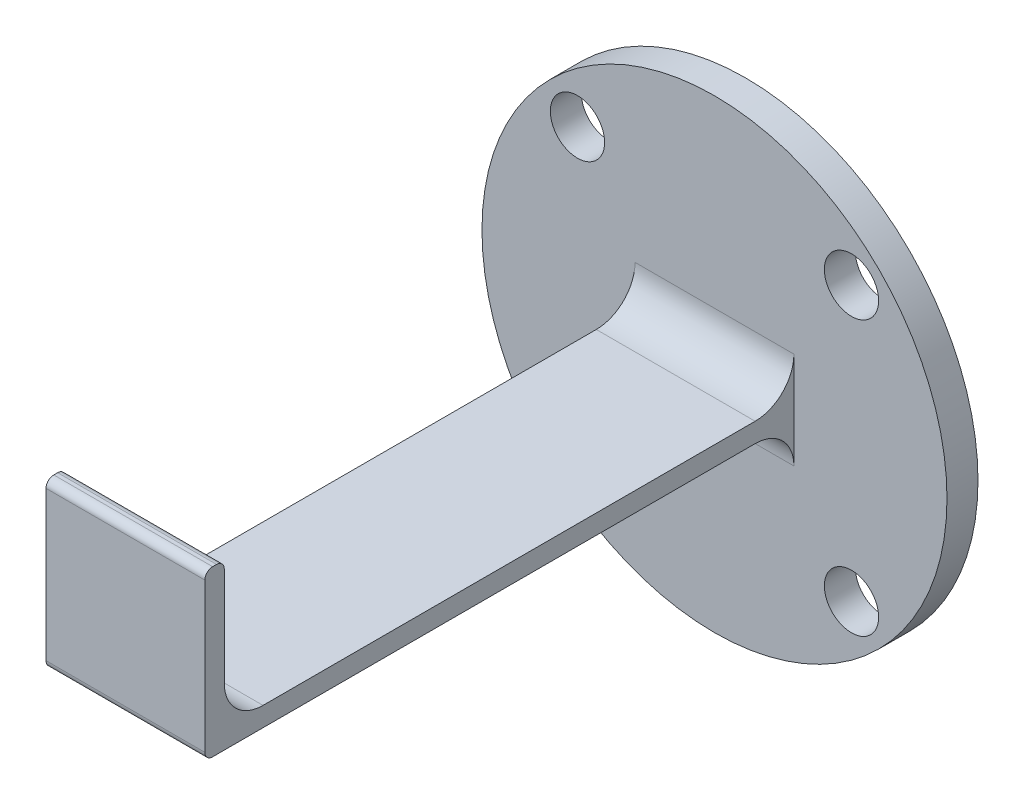
ISO-10303-21;
HEADER;
FILE_DESCRIPTION(('STEP AP214'),'2;1');
FILE_NAME('part.step','',(''),(''),'','','');
FILE_SCHEMA(('AUTOMOTIVE_DESIGN { 1 0 10303 214 1 1 1 1 }'));
ENDSEC;
DATA;
#1=APPLICATION_CONTEXT('core data for automotive mechanical design processes');
#2=APPLICATION_PROTOCOL_DEFINITION('international standard','automotive_design',2000,#1);
#3=PRODUCT_CONTEXT('',#1,'mechanical');
#4=PRODUCT('Part','Part','',(#3));
#5=PRODUCT_RELATED_PRODUCT_CATEGORY('part','',(#4));
#6=PRODUCT_DEFINITION_FORMATION('','',#4);
#7=PRODUCT_DEFINITION_CONTEXT('part definition',#1,'design');
#8=PRODUCT_DEFINITION('design','',#6,#7);
#9=PRODUCT_DEFINITION_SHAPE('','',#8);
#10=(LENGTH_UNIT() NAMED_UNIT(*) SI_UNIT(.MILLI.,.METRE.));
#11=(NAMED_UNIT(*) PLANE_ANGLE_UNIT() SI_UNIT($,.RADIAN.));
#12=(NAMED_UNIT(*) SI_UNIT($,.STERADIAN.) SOLID_ANGLE_UNIT());
#13=UNCERTAINTY_MEASURE_WITH_UNIT(LENGTH_MEASURE(1.E-05),#10,'distance_accuracy_value','');
#14=(GEOMETRIC_REPRESENTATION_CONTEXT(3) GLOBAL_UNCERTAINTY_ASSIGNED_CONTEXT((#13)) GLOBAL_UNIT_ASSIGNED_CONTEXT((#10,
#11,#12)) REPRESENTATION_CONTEXT('',''));
#15=CARTESIAN_POINT('',(0.,0.,0.));
#16=DIRECTION('',(0.,0.,1.));
#17=DIRECTION('',(1.,0.,0.));
#18=AXIS2_PLACEMENT_3D('',#15,#16,#17);
#19=CARTESIAN_POINT('',(-10.25,1.25,80.));
#20=DIRECTION('',(0.,-1.,0.));
#21=DIRECTION('',(0.,0.,-1.));
#22=AXIS2_PLACEMENT_3D('',#19,#20,#21);
#23=PLANE('',#22);
#24=DIRECTION('',(0.,0.,-1.));
#25=VECTOR('',#24,1.);
#26=CARTESIAN_POINT('',(-10.25,1.25,80.));
#27=LINE('',#26,#25);
#28=CARTESIAN_POINT('',(-10.25,1.25,72.5));
#29=VERTEX_POINT('',#28);
#30=CARTESIAN_POINT('',(-10.25,1.25,8.99999999999999));
#31=VERTEX_POINT('',#30);
#32=EDGE_CURVE('E259',#29,#31,#27,.T.);
#33=ORIENTED_EDGE('',*,*,#32,.F.);
#34=DIRECTION('',(-1.,0.,0.));
#35=VECTOR('',#34,1.);
#36=CARTESIAN_POINT('',(10.25,1.25,72.5));
#37=LINE('',#36,#35);
#38=CARTESIAN_POINT('',(10.25,1.25,72.5));
#39=VERTEX_POINT('',#38);
#40=EDGE_CURVE('E160',#29,#39,#37,.F.);
#41=ORIENTED_EDGE('',*,*,#40,.T.);
#42=DIRECTION('',(0.,0.,-1.));
#43=VECTOR('',#42,1.);
#44=CARTESIAN_POINT('',(10.25,1.25,80.));
#45=LINE('',#44,#43);
#46=CARTESIAN_POINT('',(10.25,1.25,8.99999999999999));
#47=VERTEX_POINT('',#46);
#48=EDGE_CURVE('E145',#39,#47,#45,.T.);
#49=ORIENTED_EDGE('',*,*,#48,.T.);
#50=DIRECTION('',(1.,0.,0.));
#51=VECTOR('',#50,1.);
#52=CARTESIAN_POINT('',(-10.25,1.25,8.99999999999999));
#53=LINE('',#52,#51);
#54=EDGE_CURVE('E155',#47,#31,#53,.F.);
#55=ORIENTED_EDGE('',*,*,#54,.T.);
#56=EDGE_LOOP('',(#33,#41,#49,#55));
#57=FACE_BOUND('',#56,.T.);
#58=ADVANCED_FACE('F38',(#57),#23,.F.);
#59=CARTESIAN_POINT('',(0.,0.,4.));
#60=DIRECTION('',(0.,0.,1.));
#61=DIRECTION('',(1.,0.,0.));
#62=AXIS2_PLACEMENT_3D('',#59,#60,#61);
#63=PLANE('',#62);
#64=CARTESIAN_POINT('',(-17.6776695296637,-17.6776695296637,4.));
#65=DIRECTION('',(0.,0.,1.));
#66=DIRECTION('',(-1.,0.,0.));
#67=AXIS2_PLACEMENT_3D('',#64,#65,#66);
#68=CIRCLE('',#67,3.5);
#69=CARTESIAN_POINT('',(-21.1776695296637,-17.6776695296637,4.));
#70=VERTEX_POINT('',#69);
#71=EDGE_CURVE('E271',#70,#70,#68,.T.);
#72=ORIENTED_EDGE('',*,*,#71,.F.);
#73=EDGE_LOOP('',(#72));
#74=FACE_BOUND('',#73,.T.);
#75=CARTESIAN_POINT('',(17.6776695296637,-17.6776695296637,4.));
#76=DIRECTION('',(0.,0.,1.));
#77=DIRECTION('',(1.,0.,0.));
#78=AXIS2_PLACEMENT_3D('',#75,#76,#77);
#79=CIRCLE('',#78,3.5);
#80=CARTESIAN_POINT('',(21.1776695296637,-17.6776695296637,4.));
#81=VERTEX_POINT('',#80);
#82=EDGE_CURVE('E285',#81,#81,#79,.T.);
#83=ORIENTED_EDGE('',*,*,#82,.F.);
#84=EDGE_LOOP('',(#83));
#85=FACE_BOUND('',#84,.T.);
#86=CARTESIAN_POINT('',(17.6776695296637,17.6776695296637,4.));
#87=DIRECTION('',(0.,0.,1.));
#88=DIRECTION('',(-1.,0.,0.));
#89=AXIS2_PLACEMENT_3D('',#86,#87,#88);
#90=CIRCLE('',#89,3.5);
#91=CARTESIAN_POINT('',(14.1776695296637,17.6776695296637,4.));
#92=VERTEX_POINT('',#91);
#93=EDGE_CURVE('E277',#92,#92,#90,.T.);
#94=ORIENTED_EDGE('',*,*,#93,.F.);
#95=EDGE_LOOP('',(#94));
#96=FACE_BOUND('',#95,.T.);
#97=CARTESIAN_POINT('',(-17.6776695296637,17.6776695296637,4.));
#98=DIRECTION('',(0.,0.,1.));
#99=DIRECTION('',(1.,0.,0.));
#100=AXIS2_PLACEMENT_3D('',#97,#98,#99);
#101=CIRCLE('',#100,3.5);
#102=CARTESIAN_POINT('',(-14.1776695296637,17.6776695296637,4.));
#103=VERTEX_POINT('',#102);
#104=EDGE_CURVE('E276',#103,#103,#101,.T.);
#105=ORIENTED_EDGE('',*,*,#104,.F.);
#106=EDGE_LOOP('',(#105));
#107=FACE_BOUND('',#106,.T.);
#108=CARTESIAN_POINT('',(0.,0.,4.));
#109=DIRECTION('',(0.,0.,1.));
#110=DIRECTION('',(1.,0.,0.));
#111=AXIS2_PLACEMENT_3D('',#108,#109,#110);
#112=CIRCLE('',#111,30.);
#113=CARTESIAN_POINT('',(30.,0.,4.));
#114=VERTEX_POINT('',#113);
#115=EDGE_CURVE('E156',#114,#114,#112,.T.);
#116=ORIENTED_EDGE('',*,*,#115,.T.);
#117=EDGE_LOOP('',(#116));
#118=FACE_BOUND('',#117,.T.);
#119=DIRECTION('',(-1.,0.,0.));
#120=VECTOR('',#119,1.);
#121=CARTESIAN_POINT('',(0.,-6.25,4.));
#122=LINE('',#121,#120);
#123=CARTESIAN_POINT('',(10.25,-6.25,4.));
#124=VERTEX_POINT('',#123);
#125=CARTESIAN_POINT('',(-10.25,-6.25,4.));
#126=VERTEX_POINT('',#125);
#127=EDGE_CURVE('E173',#124,#126,#122,.T.);
#128=ORIENTED_EDGE('',*,*,#127,.T.);
#129=DIRECTION('',(0.,1.,0.));
#130=VECTOR('',#129,1.);
#131=CARTESIAN_POINT('',(-10.25,0.,4.));
#132=LINE('',#131,#130);
#133=CARTESIAN_POINT('',(-10.25,6.25,4.));
#134=VERTEX_POINT('',#133);
#135=EDGE_CURVE('E265',#126,#134,#132,.T.);
#136=ORIENTED_EDGE('',*,*,#135,.T.);
#137=DIRECTION('',(1.,0.,0.));
#138=VECTOR('',#137,1.);
#139=CARTESIAN_POINT('',(0.,6.25,4.));
#140=LINE('',#139,#138);
#141=CARTESIAN_POINT('',(10.25,6.25,4.));
#142=VERTEX_POINT('',#141);
#143=EDGE_CURVE('E169',#134,#142,#140,.T.);
#144=ORIENTED_EDGE('',*,*,#143,.T.);
#145=DIRECTION('',(0.,-1.,0.));
#146=VECTOR('',#145,1.);
#147=CARTESIAN_POINT('',(10.25,0.,4.));
#148=LINE('',#147,#146);
#149=EDGE_CURVE('E268',#142,#124,#148,.T.);
#150=ORIENTED_EDGE('',*,*,#149,.T.);
#151=EDGE_LOOP('',(#128,#136,#144,#150));
#152=FACE_BOUND('',#151,.T.);
#153=ADVANCED_FACE('F306',(#74,#85,#96,#107,#118,#152),#63,.T.);
#154=CARTESIAN_POINT('',(0.,0.,4.));
#155=DIRECTION('',(0.,0.,-1.));
#156=DIRECTION('',(-1.,0.,0.));
#157=AXIS2_PLACEMENT_3D('',#154,#155,#156);
#158=CYLINDRICAL_SURFACE('',#157,30.);
#159=ORIENTED_EDGE('',*,*,#115,.F.);
#160=EDGE_LOOP('',(#159));
#161=FACE_BOUND('',#160,.T.);
#162=CARTESIAN_POINT('',(0.,0.,0.));
#163=DIRECTION('',(0.,0.,1.));
#164=DIRECTION('',(1.,0.,0.));
#165=AXIS2_PLACEMENT_3D('',#162,#163,#164);
#166=CIRCLE('',#165,30.);
#167=CARTESIAN_POINT('',(30.,0.,0.));
#168=VERTEX_POINT('',#167);
#169=EDGE_CURVE('E163',#168,#168,#166,.T.);
#170=ORIENTED_EDGE('',*,*,#169,.T.);
#171=EDGE_LOOP('',(#170));
#172=FACE_BOUND('',#171,.T.);
#173=ADVANCED_FACE('F309',(#161,#172),#158,.T.);
#174=CARTESIAN_POINT('',(0.,0.,0.));
#175=DIRECTION('',(0.,0.,1.));
#176=DIRECTION('',(1.,0.,0.));
#177=AXIS2_PLACEMENT_3D('',#174,#175,#176);
#178=PLANE('',#177);
#179=ORIENTED_EDGE('',*,*,#169,.F.);
#180=EDGE_LOOP('',(#179));
#181=FACE_BOUND('',#180,.T.);
#182=CARTESIAN_POINT('',(-17.6776695296637,17.6776695296637,0.));
#183=DIRECTION('',(0.,0.,1.));
#184=DIRECTION('',(1.,0.,0.));
#185=AXIS2_PLACEMENT_3D('',#182,#183,#184);
#186=CIRCLE('',#185,3.5);
#187=CARTESIAN_POINT('',(-14.1776695296637,17.6776695296637,0.));
#188=VERTEX_POINT('',#187);
#189=EDGE_CURVE('E296',#188,#188,#186,.T.);
#190=ORIENTED_EDGE('',*,*,#189,.T.);
#191=EDGE_LOOP('',(#190));
#192=FACE_BOUND('',#191,.T.);
#193=CARTESIAN_POINT('',(17.6776695296637,17.6776695296637,0.));
#194=DIRECTION('',(0.,0.,1.));
#195=DIRECTION('',(-1.,0.,0.));
#196=AXIS2_PLACEMENT_3D('',#193,#194,#195);
#197=CIRCLE('',#196,3.5);
#198=CARTESIAN_POINT('',(14.1776695296637,17.6776695296637,0.));
#199=VERTEX_POINT('',#198);
#200=EDGE_CURVE('E272',#199,#199,#197,.T.);
#201=ORIENTED_EDGE('',*,*,#200,.T.);
#202=EDGE_LOOP('',(#201));
#203=FACE_BOUND('',#202,.T.);
#204=CARTESIAN_POINT('',(17.6776695296637,-17.6776695296637,0.));
#205=DIRECTION('',(0.,0.,1.));
#206=DIRECTION('',(1.,0.,0.));
#207=AXIS2_PLACEMENT_3D('',#204,#205,#206);
#208=CIRCLE('',#207,3.5);
#209=CARTESIAN_POINT('',(21.1776695296637,-17.6776695296637,0.));
#210=VERTEX_POINT('',#209);
#211=EDGE_CURVE('E281',#210,#210,#208,.T.);
#212=ORIENTED_EDGE('',*,*,#211,.T.);
#213=EDGE_LOOP('',(#212));
#214=FACE_BOUND('',#213,.T.);
#215=CARTESIAN_POINT('',(-17.6776695296637,-17.6776695296637,0.));
#216=DIRECTION('',(0.,0.,1.));
#217=DIRECTION('',(-1.,0.,0.));
#218=AXIS2_PLACEMENT_3D('',#215,#216,#217);
#219=CIRCLE('',#218,3.5);
#220=CARTESIAN_POINT('',(-21.1776695296637,-17.6776695296637,0.));
#221=VERTEX_POINT('',#220);
#222=EDGE_CURVE('E289',#221,#221,#219,.T.);
#223=ORIENTED_EDGE('',*,*,#222,.T.);
#224=EDGE_LOOP('',(#223));
#225=FACE_BOUND('',#224,.T.);
#226=ADVANCED_FACE('F352',(#181,#192,#203,#214,#225),#178,.F.);
#227=CARTESIAN_POINT('',(-17.6776695296637,17.6776695296637,0.));
#228=DIRECTION('',(0.,0.,1.));
#229=DIRECTION('',(1.,0.,0.));
#230=AXIS2_PLACEMENT_3D('',#227,#228,#229);
#231=CYLINDRICAL_SURFACE('',#230,3.5);
#232=ORIENTED_EDGE('',*,*,#189,.F.);
#233=EDGE_LOOP('',(#232));
#234=FACE_BOUND('',#233,.T.);
#235=ORIENTED_EDGE('',*,*,#104,.T.);
#236=EDGE_LOOP('',(#235));
#237=FACE_BOUND('',#236,.T.);
#238=ADVANCED_FACE('F304',(#234,#237),#231,.F.);
#239=CARTESIAN_POINT('',(17.6776695296637,17.6776695296637,0.));
#240=DIRECTION('',(0.,0.,1.));
#241=DIRECTION('',(1.,0.,0.));
#242=AXIS2_PLACEMENT_3D('',#239,#240,#241);
#243=CYLINDRICAL_SURFACE('',#242,3.5);
#244=ORIENTED_EDGE('',*,*,#200,.F.);
#245=EDGE_LOOP('',(#244));
#246=FACE_BOUND('',#245,.T.);
#247=ORIENTED_EDGE('',*,*,#93,.T.);
#248=EDGE_LOOP('',(#247));
#249=FACE_BOUND('',#248,.T.);
#250=ADVANCED_FACE('F340',(#246,#249),#243,.F.);
#251=CARTESIAN_POINT('',(17.6776695296637,-17.6776695296637,0.));
#252=DIRECTION('',(0.,0.,1.));
#253=DIRECTION('',(1.,0.,0.));
#254=AXIS2_PLACEMENT_3D('',#251,#252,#253);
#255=CYLINDRICAL_SURFACE('',#254,3.5);
#256=ORIENTED_EDGE('',*,*,#211,.F.);
#257=EDGE_LOOP('',(#256));
#258=FACE_BOUND('',#257,.T.);
#259=ORIENTED_EDGE('',*,*,#82,.T.);
#260=EDGE_LOOP('',(#259));
#261=FACE_BOUND('',#260,.T.);
#262=ADVANCED_FACE('F343',(#258,#261),#255,.F.);
#263=CARTESIAN_POINT('',(-17.6776695296637,-17.6776695296637,0.));
#264=DIRECTION('',(0.,0.,1.));
#265=DIRECTION('',(1.,0.,0.));
#266=AXIS2_PLACEMENT_3D('',#263,#264,#265);
#267=CYLINDRICAL_SURFACE('',#266,3.5);
#268=ORIENTED_EDGE('',*,*,#222,.F.);
#269=EDGE_LOOP('',(#268));
#270=FACE_BOUND('',#269,.T.);
#271=ORIENTED_EDGE('',*,*,#71,.T.);
#272=EDGE_LOOP('',(#271));
#273=FACE_BOUND('',#272,.T.);
#274=ADVANCED_FACE('F339',(#270,#273),#267,.F.);
#275=CARTESIAN_POINT('',(10.25,-1.25,80.));
#276=DIRECTION('',(-1.,0.,0.));
#277=DIRECTION('',(0.,0.,1.));
#278=AXIS2_PLACEMENT_3D('',#275,#276,#277);
#279=PLANE('',#278);
#280=DIRECTION('',(0.,1.,0.));
#281=VECTOR('',#280,1.);
#282=CARTESIAN_POINT('',(10.25,-1.25,80.));
#283=LINE('',#282,#281);
#284=CARTESIAN_POINT('',(10.25,-0.25,80.));
#285=VERTEX_POINT('',#284);
#286=CARTESIAN_POINT('',(10.25,19.,80.));
#287=VERTEX_POINT('',#286);
#288=EDGE_CURVE('E136',#285,#287,#283,.T.);
#289=ORIENTED_EDGE('',*,*,#288,.F.);
#290=CARTESIAN_POINT('',(10.25,-0.25,79.));
#291=DIRECTION('',(-1.,0.,0.));
#292=DIRECTION('',(0.,0.,1.));
#293=AXIS2_PLACEMENT_3D('',#290,#291,#292);
#294=CIRCLE('',#293,1.);
#295=CARTESIAN_POINT('',(10.25,-1.25,79.));
#296=VERTEX_POINT('',#295);
#297=EDGE_CURVE('E210',#285,#296,#294,.F.);
#298=ORIENTED_EDGE('',*,*,#297,.T.);
#299=DIRECTION('',(0.,0.,-1.));
#300=VECTOR('',#299,1.);
#301=CARTESIAN_POINT('',(10.25,-1.25,80.));
#302=LINE('',#301,#300);
#303=CARTESIAN_POINT('',(10.25,-1.25,8.99999999999999));
#304=VERTEX_POINT('',#303);
#305=EDGE_CURVE('E253',#296,#304,#302,.T.);
#306=ORIENTED_EDGE('',*,*,#305,.T.);
#307=CARTESIAN_POINT('',(10.25,-6.25,9.));
#308=DIRECTION('',(-1.,0.,0.));
#309=DIRECTION('',(0.,0.,1.));
#310=AXIS2_PLACEMENT_3D('',#307,#308,#309);
#311=CIRCLE('',#310,5.);
#312=EDGE_CURVE('E186',#304,#124,#311,.T.);
#313=ORIENTED_EDGE('',*,*,#312,.T.);
#314=ORIENTED_EDGE('',*,*,#149,.F.);
#315=CARTESIAN_POINT('',(10.25,6.25,9.));
#316=DIRECTION('',(-1.,0.,0.));
#317=DIRECTION('',(0.,0.,1.));
#318=AXIS2_PLACEMENT_3D('',#315,#316,#317);
#319=CIRCLE('',#318,5.);
#320=EDGE_CURVE('E190',#142,#47,#319,.T.);
#321=ORIENTED_EDGE('',*,*,#320,.T.);
#322=ORIENTED_EDGE('',*,*,#48,.F.);
#323=CARTESIAN_POINT('',(10.25,6.25,72.5));
#324=DIRECTION('',(-1.,0.,0.));
#325=DIRECTION('',(0.,0.,1.));
#326=AXIS2_PLACEMENT_3D('',#323,#324,#325);
#327=CIRCLE('',#326,5.);
#328=CARTESIAN_POINT('',(10.25,6.25,77.5));
#329=VERTEX_POINT('',#328);
#330=EDGE_CURVE('E141',#39,#329,#327,.T.);
#331=ORIENTED_EDGE('',*,*,#330,.T.);
#332=DIRECTION('',(0.,-1.,0.));
#333=VECTOR('',#332,1.);
#334=CARTESIAN_POINT('',(10.25,20.,77.5));
#335=LINE('',#334,#333);
#336=CARTESIAN_POINT('',(10.25,19.,77.5));
#337=VERTEX_POINT('',#336);
#338=EDGE_CURVE('E127',#337,#329,#335,.T.);
#339=ORIENTED_EDGE('',*,*,#338,.F.);
#340=CARTESIAN_POINT('',(10.25,19.,78.5));
#341=DIRECTION('',(-1.,0.,0.));
#342=DIRECTION('',(0.,0.,1.));
#343=AXIS2_PLACEMENT_3D('',#340,#341,#342);
#344=CIRCLE('',#343,1.);
#345=CARTESIAN_POINT('',(10.25,20.,78.5));
#346=VERTEX_POINT('',#345);
#347=EDGE_CURVE('E207',#337,#346,#344,.F.);
#348=ORIENTED_EDGE('',*,*,#347,.T.);
#349=DIRECTION('',(0.,0.,-1.));
#350=VECTOR('',#349,1.);
#351=CARTESIAN_POINT('',(10.25,20.,80.));
#352=LINE('',#351,#350);
#353=CARTESIAN_POINT('',(10.25,20.,79.));
#354=VERTEX_POINT('',#353);
#355=EDGE_CURVE('E235',#354,#346,#352,.T.);
#356=ORIENTED_EDGE('',*,*,#355,.F.);
#357=CARTESIAN_POINT('',(10.25,19.,79.));
#358=DIRECTION('',(-1.,0.,0.));
#359=DIRECTION('',(0.,0.,1.));
#360=AXIS2_PLACEMENT_3D('',#357,#358,#359);
#361=CIRCLE('',#360,1.);
#362=EDGE_CURVE('E204',#354,#287,#361,.F.);
#363=ORIENTED_EDGE('',*,*,#362,.T.);
#364=EDGE_LOOP('',(#289,#298,#306,#313,#314,#321,#322,#331,#339,#348,#356,#363));
#365=FACE_BOUND('',#364,.T.);
#366=ADVANCED_FACE('F143',(#365),#279,.F.);
#367=CARTESIAN_POINT('',(-10.25,-1.25,80.));
#368=DIRECTION('',(1.,0.,0.));
#369=DIRECTION('',(0.,0.,-1.));
#370=AXIS2_PLACEMENT_3D('',#367,#368,#369);
#371=PLANE('',#370);
#372=DIRECTION('',(0.,0.,-1.));
#373=VECTOR('',#372,1.);
#374=CARTESIAN_POINT('',(-10.25,-1.25,80.));
#375=LINE('',#374,#373);
#376=CARTESIAN_POINT('',(-10.25,-1.25,79.));
#377=VERTEX_POINT('',#376);
#378=CARTESIAN_POINT('',(-10.25,-1.25,8.99999999999999));
#379=VERTEX_POINT('',#378);
#380=EDGE_CURVE('E256',#377,#379,#375,.T.);
#381=ORIENTED_EDGE('',*,*,#380,.F.);
#382=CARTESIAN_POINT('',(-10.25,-0.25,79.));
#383=DIRECTION('',(1.,0.,0.));
#384=DIRECTION('',(0.,0.,-1.));
#385=AXIS2_PLACEMENT_3D('',#382,#383,#384);
#386=CIRCLE('',#385,1.);
#387=CARTESIAN_POINT('',(-10.25,-0.25,80.));
#388=VERTEX_POINT('',#387);
#389=EDGE_CURVE('E220',#377,#388,#386,.F.);
#390=ORIENTED_EDGE('',*,*,#389,.T.);
#391=DIRECTION('',(0.,-1.,0.));
#392=VECTOR('',#391,1.);
#393=CARTESIAN_POINT('',(-10.25,-1.25,80.));
#394=LINE('',#393,#392);
#395=CARTESIAN_POINT('',(-10.25,19.,80.));
#396=VERTEX_POINT('',#395);
#397=EDGE_CURVE('E249',#396,#388,#394,.T.);
#398=ORIENTED_EDGE('',*,*,#397,.F.);
#399=CARTESIAN_POINT('',(-10.25,19.,79.));
#400=DIRECTION('',(1.,0.,0.));
#401=DIRECTION('',(0.,0.,-1.));
#402=AXIS2_PLACEMENT_3D('',#399,#400,#401);
#403=CIRCLE('',#402,1.);
#404=CARTESIAN_POINT('',(-10.25,20.,79.));
#405=VERTEX_POINT('',#404);
#406=EDGE_CURVE('E60',#396,#405,#403,.F.);
#407=ORIENTED_EDGE('',*,*,#406,.T.);
#408=DIRECTION('',(0.,0.,1.));
#409=VECTOR('',#408,1.);
#410=CARTESIAN_POINT('',(-10.25,20.,80.));
#411=LINE('',#410,#409);
#412=CARTESIAN_POINT('',(-10.25,20.,78.5));
#413=VERTEX_POINT('',#412);
#414=EDGE_CURVE('E232',#413,#405,#411,.T.);
#415=ORIENTED_EDGE('',*,*,#414,.F.);
#416=CARTESIAN_POINT('',(-10.25,19.,78.5));
#417=DIRECTION('',(1.,0.,0.));
#418=DIRECTION('',(0.,0.,-1.));
#419=AXIS2_PLACEMENT_3D('',#416,#417,#418);
#420=CIRCLE('',#419,1.);
#421=CARTESIAN_POINT('',(-10.25,19.,77.5));
#422=VERTEX_POINT('',#421);
#423=EDGE_CURVE('E54',#413,#422,#420,.F.);
#424=ORIENTED_EDGE('',*,*,#423,.T.);
#425=DIRECTION('',(0.,-1.,0.));
#426=VECTOR('',#425,1.);
#427=CARTESIAN_POINT('',(-10.25,20.,77.5));
#428=LINE('',#427,#426);
#429=CARTESIAN_POINT('',(-10.25,6.25,77.5));
#430=VERTEX_POINT('',#429);
#431=EDGE_CURVE('E137',#422,#430,#428,.T.);
#432=ORIENTED_EDGE('',*,*,#431,.T.);
#433=CARTESIAN_POINT('',(-10.25,6.25,72.5));
#434=DIRECTION('',(1.,0.,0.));
#435=DIRECTION('',(0.,0.,-1.));
#436=AXIS2_PLACEMENT_3D('',#433,#434,#435);
#437=CIRCLE('',#436,5.);
#438=EDGE_CURVE('E150',#430,#29,#437,.T.);
#439=ORIENTED_EDGE('',*,*,#438,.T.);
#440=ORIENTED_EDGE('',*,*,#32,.T.);
#441=CARTESIAN_POINT('',(-10.25,6.25,9.));
#442=DIRECTION('',(1.,0.,0.));
#443=DIRECTION('',(0.,0.,-1.));
#444=AXIS2_PLACEMENT_3D('',#441,#442,#443);
#445=CIRCLE('',#444,5.);
#446=EDGE_CURVE('E193',#31,#134,#445,.T.);
#447=ORIENTED_EDGE('',*,*,#446,.T.);
#448=ORIENTED_EDGE('',*,*,#135,.F.);
#449=CARTESIAN_POINT('',(-10.25,-6.25,9.));
#450=DIRECTION('',(1.,0.,0.));
#451=DIRECTION('',(0.,0.,-1.));
#452=AXIS2_PLACEMENT_3D('',#449,#450,#451);
#453=CIRCLE('',#452,5.);
#454=EDGE_CURVE('E149',#126,#379,#453,.T.);
#455=ORIENTED_EDGE('',*,*,#454,.T.);
#456=EDGE_LOOP('',(#381,#390,#398,#407,#415,#424,#432,#439,#440,#447,#448,#455));
#457=FACE_BOUND('',#456,.T.);
#458=ADVANCED_FACE('F238',(#457),#371,.F.);
#459=CARTESIAN_POINT('',(-10.25,-1.25,80.));
#460=DIRECTION('',(0.,1.,0.));
#461=DIRECTION('',(0.,0.,1.));
#462=AXIS2_PLACEMENT_3D('',#459,#460,#461);
#463=PLANE('',#462);
#464=ORIENTED_EDGE('',*,*,#305,.F.);
#465=DIRECTION('',(1.,0.,0.));
#466=VECTOR('',#465,1.);
#467=CARTESIAN_POINT('',(-10.25,-1.25,79.));
#468=LINE('',#467,#466);
#469=EDGE_CURVE('E213',#296,#377,#468,.F.);
#470=ORIENTED_EDGE('',*,*,#469,.T.);
#471=ORIENTED_EDGE('',*,*,#380,.T.);
#472=DIRECTION('',(-1.,0.,0.));
#473=VECTOR('',#472,1.);
#474=CARTESIAN_POINT('',(-10.25,-1.25,8.99999999999999));
#475=LINE('',#474,#473);
#476=EDGE_CURVE('E177',#379,#304,#475,.F.);
#477=ORIENTED_EDGE('',*,*,#476,.T.);
#478=EDGE_LOOP('',(#464,#470,#471,#477));
#479=FACE_BOUND('',#478,.T.);
#480=ADVANCED_FACE('F383',(#479),#463,.F.);
#481=CARTESIAN_POINT('',(0.,0.,80.));
#482=DIRECTION('',(0.,0.,-1.));
#483=DIRECTION('',(-1.,0.,0.));
#484=AXIS2_PLACEMENT_3D('',#481,#482,#483);
#485=PLANE('',#484);
#486=ORIENTED_EDGE('',*,*,#397,.T.);
#487=DIRECTION('',(1.,0.,0.));
#488=VECTOR('',#487,1.);
#489=CARTESIAN_POINT('',(0.,-0.25,80.));
#490=LINE('',#489,#488);
#491=EDGE_CURVE('E200',#388,#285,#490,.T.);
#492=ORIENTED_EDGE('',*,*,#491,.T.);
#493=ORIENTED_EDGE('',*,*,#288,.T.);
#494=DIRECTION('',(1.,0.,0.));
#495=VECTOR('',#494,1.);
#496=CARTESIAN_POINT('',(0.,19.,80.));
#497=LINE('',#496,#495);
#498=EDGE_CURVE('E197',#287,#396,#497,.F.);
#499=ORIENTED_EDGE('',*,*,#498,.T.);
#500=EDGE_LOOP('',(#486,#492,#493,#499));
#501=FACE_BOUND('',#500,.T.);
#502=ADVANCED_FACE('F378',(#501),#485,.F.);
#503=CARTESIAN_POINT('',(-10.25,20.,77.5));
#504=DIRECTION('',(0.,0.,1.));
#505=DIRECTION('',(1.,0.,0.));
#506=AXIS2_PLACEMENT_3D('',#503,#504,#505);
#507=PLANE('',#506);
#508=ORIENTED_EDGE('',*,*,#431,.F.);
#509=DIRECTION('',(-1.,0.,0.));
#510=VECTOR('',#509,1.);
#511=CARTESIAN_POINT('',(-10.25,19.,77.5));
#512=LINE('',#511,#510);
#513=EDGE_CURVE('E11',#422,#337,#512,.F.);
#514=ORIENTED_EDGE('',*,*,#513,.T.);
#515=ORIENTED_EDGE('',*,*,#338,.T.);
#516=DIRECTION('',(-1.,0.,0.));
#517=VECTOR('',#516,1.);
#518=CARTESIAN_POINT('',(-10.25,6.25,77.5));
#519=LINE('',#518,#517);
#520=EDGE_CURVE('E131',#329,#430,#519,.T.);
#521=ORIENTED_EDGE('',*,*,#520,.T.);
#522=EDGE_LOOP('',(#508,#514,#515,#521));
#523=FACE_BOUND('',#522,.T.);
#524=ADVANCED_FACE('F129',(#523),#507,.F.);
#525=CARTESIAN_POINT('',(0.,20.,0.));
#526=DIRECTION('',(0.,-1.,0.));
#527=DIRECTION('',(0.,0.,-1.));
#528=AXIS2_PLACEMENT_3D('',#525,#526,#527);
#529=PLANE('',#528);
#530=ORIENTED_EDGE('',*,*,#355,.T.);
#531=DIRECTION('',(-1.,0.,0.));
#532=VECTOR('',#531,1.);
#533=CARTESIAN_POINT('',(0.,20.,78.5));
#534=LINE('',#533,#532);
#535=EDGE_CURVE('E47',#346,#413,#534,.T.);
#536=ORIENTED_EDGE('',*,*,#535,.T.);
#537=ORIENTED_EDGE('',*,*,#414,.T.);
#538=DIRECTION('',(1.,0.,0.));
#539=VECTOR('',#538,1.);
#540=CARTESIAN_POINT('',(0.,20.,79.));
#541=LINE('',#540,#539);
#542=EDGE_CURVE('E223',#405,#354,#541,.T.);
#543=ORIENTED_EDGE('',*,*,#542,.T.);
#544=EDGE_LOOP('',(#530,#536,#537,#543));
#545=FACE_BOUND('',#544,.T.);
#546=ADVANCED_FACE('F231',(#545),#529,.F.);
#547=CARTESIAN_POINT('',(-10.25,6.25,72.5));
#548=DIRECTION('',(1.,0.,0.));
#549=DIRECTION('',(0.,0.,-1.));
#550=AXIS2_PLACEMENT_3D('',#547,#548,#549);
#551=CYLINDRICAL_SURFACE('',#550,5.);
#552=ORIENTED_EDGE('',*,*,#330,.F.);
#553=ORIENTED_EDGE('',*,*,#40,.F.);
#554=ORIENTED_EDGE('',*,*,#438,.F.);
#555=ORIENTED_EDGE('',*,*,#520,.F.);
#556=EDGE_LOOP('',(#552,#553,#554,#555));
#557=FACE_BOUND('',#556,.T.);
#558=ADVANCED_FACE('F153',(#557),#551,.F.);
#559=CARTESIAN_POINT('',(0.,-6.25,9.));
#560=DIRECTION('',(-1.,0.,0.));
#561=DIRECTION('',(0.,0.,1.));
#562=AXIS2_PLACEMENT_3D('',#559,#560,#561);
#563=CYLINDRICAL_SURFACE('',#562,5.);
#564=ORIENTED_EDGE('',*,*,#312,.F.);
#565=ORIENTED_EDGE('',*,*,#476,.F.);
#566=ORIENTED_EDGE('',*,*,#454,.F.);
#567=ORIENTED_EDGE('',*,*,#127,.F.);
#568=EDGE_LOOP('',(#564,#565,#566,#567));
#569=FACE_BOUND('',#568,.T.);
#570=ADVANCED_FACE('F318',(#569),#563,.F.);
#571=CARTESIAN_POINT('',(0.,6.25,9.));
#572=DIRECTION('',(1.,0.,0.));
#573=DIRECTION('',(0.,0.,-1.));
#574=AXIS2_PLACEMENT_3D('',#571,#572,#573);
#575=CYLINDRICAL_SURFACE('',#574,5.);
#576=ORIENTED_EDGE('',*,*,#446,.F.);
#577=ORIENTED_EDGE('',*,*,#54,.F.);
#578=ORIENTED_EDGE('',*,*,#320,.F.);
#579=ORIENTED_EDGE('',*,*,#143,.F.);
#580=EDGE_LOOP('',(#576,#577,#578,#579));
#581=FACE_BOUND('',#580,.T.);
#582=ADVANCED_FACE('F327',(#581),#575,.F.);
#583=CARTESIAN_POINT('',(0.,-0.25,79.));
#584=DIRECTION('',(1.,0.,0.));
#585=DIRECTION('',(0.,0.,-1.));
#586=AXIS2_PLACEMENT_3D('',#583,#584,#585);
#587=CYLINDRICAL_SURFACE('',#586,1.);
#588=ORIENTED_EDGE('',*,*,#389,.F.);
#589=ORIENTED_EDGE('',*,*,#469,.F.);
#590=ORIENTED_EDGE('',*,*,#297,.F.);
#591=ORIENTED_EDGE('',*,*,#491,.F.);
#592=EDGE_LOOP('',(#588,#589,#590,#591));
#593=FACE_BOUND('',#592,.T.);
#594=ADVANCED_FACE('F367',(#593),#587,.T.);
#595=CARTESIAN_POINT('',(0.,19.,78.5));
#596=DIRECTION('',(-1.,0.,0.));
#597=DIRECTION('',(0.,0.,1.));
#598=AXIS2_PLACEMENT_3D('',#595,#596,#597);
#599=CYLINDRICAL_SURFACE('',#598,1.);
#600=ORIENTED_EDGE('',*,*,#347,.F.);
#601=ORIENTED_EDGE('',*,*,#513,.F.);
#602=ORIENTED_EDGE('',*,*,#423,.F.);
#603=ORIENTED_EDGE('',*,*,#535,.F.);
#604=EDGE_LOOP('',(#600,#601,#602,#603));
#605=FACE_BOUND('',#604,.T.);
#606=ADVANCED_FACE('F369',(#605),#599,.T.);
#607=CARTESIAN_POINT('',(0.,19.,79.));
#608=DIRECTION('',(1.,0.,0.));
#609=DIRECTION('',(0.,0.,-1.));
#610=AXIS2_PLACEMENT_3D('',#607,#608,#609);
#611=CYLINDRICAL_SURFACE('',#610,1.);
#612=ORIENTED_EDGE('',*,*,#406,.F.);
#613=ORIENTED_EDGE('',*,*,#498,.F.);
#614=ORIENTED_EDGE('',*,*,#362,.F.);
#615=ORIENTED_EDGE('',*,*,#542,.F.);
#616=EDGE_LOOP('',(#612,#613,#614,#615));
#617=FACE_BOUND('',#616,.T.);
#618=ADVANCED_FACE('F40',(#617),#611,.T.);
#619=CLOSED_SHELL('',(#58,#153,#173,#226,#238,#250,#262,#274,#366,#458,#480,#502,#524,#546,#558,
#570,#582,#594,#606,#618));
#620=MANIFOLD_SOLID_BREP('B2',#619);
#621=ADVANCED_BREP_SHAPE_REPRESENTATION('',(#18,#620),#14);
#622=SHAPE_DEFINITION_REPRESENTATION(#9,#621);
ENDSEC;
END-ISO-10303-21;
